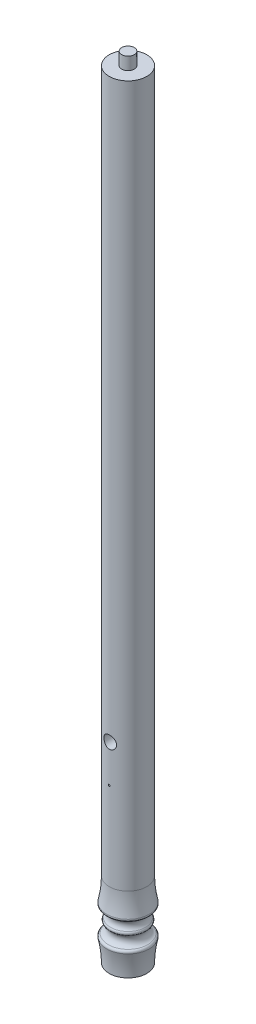
ISO-10303-21;
HEADER;
FILE_DESCRIPTION(('STEP AP214'),'2;1');
FILE_NAME('part.step','',(''),(''),'','','');
FILE_SCHEMA(('AUTOMOTIVE_DESIGN { 1 0 10303 214 1 1 1 1 }'));
ENDSEC;
DATA;
#1=APPLICATION_CONTEXT('core data for automotive mechanical design processes');
#2=APPLICATION_PROTOCOL_DEFINITION('international standard','automotive_design',2000,#1);
#3=PRODUCT_CONTEXT('',#1,'mechanical');
#4=PRODUCT('Part','Part','',(#3));
#5=PRODUCT_RELATED_PRODUCT_CATEGORY('part','',(#4));
#6=PRODUCT_DEFINITION_FORMATION('','',#4);
#7=PRODUCT_DEFINITION_CONTEXT('part definition',#1,'design');
#8=PRODUCT_DEFINITION('design','',#6,#7);
#9=PRODUCT_DEFINITION_SHAPE('','',#8);
#10=(LENGTH_UNIT() NAMED_UNIT(*) SI_UNIT(.MILLI.,.METRE.));
#11=(NAMED_UNIT(*) PLANE_ANGLE_UNIT() SI_UNIT($,.RADIAN.));
#12=(NAMED_UNIT(*) SI_UNIT($,.STERADIAN.) SOLID_ANGLE_UNIT());
#13=UNCERTAINTY_MEASURE_WITH_UNIT(LENGTH_MEASURE(1.E-05),#10,'distance_accuracy_value','');
#14=(GEOMETRIC_REPRESENTATION_CONTEXT(3) GLOBAL_UNCERTAINTY_ASSIGNED_CONTEXT((#13)) GLOBAL_UNIT_ASSIGNED_CONTEXT((#10,
#11,#12)) REPRESENTATION_CONTEXT('',''));
#15=CARTESIAN_POINT('',(0.,0.,0.));
#16=DIRECTION('',(0.,0.,1.));
#17=DIRECTION('',(1.,0.,0.));
#18=AXIS2_PLACEMENT_3D('',#15,#16,#17);
#19=CARTESIAN_POINT('',(6.35,800.1,0.));
#20=DIRECTION('',(0.,1.,0.));
#21=DIRECTION('',(0.,0.,1.));
#22=AXIS2_PLACEMENT_3D('',#19,#20,#21);
#23=PLANE('',#22);
#24=CARTESIAN_POINT('',(0.,800.1,0.));
#25=DIRECTION('',(0.,-1.,0.));
#26=DIRECTION('',(0.,0.,-1.));
#27=AXIS2_PLACEMENT_3D('',#24,#25,#26);
#28=CIRCLE('',#27,6.35);
#29=CARTESIAN_POINT('',(0.,800.1,-6.35));
#30=VERTEX_POINT('',#29);
#31=EDGE_CURVE('E49',#30,#30,#28,.T.);
#32=ORIENTED_EDGE('',*,*,#31,.F.);
#33=EDGE_LOOP('',(#32));
#34=FACE_BOUND('',#33,.T.);
#35=ADVANCED_FACE('F30',(#34),#23,.T.);
#36=CARTESIAN_POINT('',(0.,-55.,0.));
#37=DIRECTION('',(0.,-1.,0.));
#38=DIRECTION('',(0.,0.,-1.));
#39=AXIS2_PLACEMENT_3D('',#36,#37,#38);
#40=CYLINDRICAL_SURFACE('',#39,6.35);
#41=ORIENTED_EDGE('',*,*,#31,.T.);
#42=EDGE_LOOP('',(#41));
#43=FACE_BOUND('',#42,.T.);
#44=CARTESIAN_POINT('',(0.,787.4,0.));
#45=DIRECTION('',(0.,-1.,0.));
#46=DIRECTION('',(0.,0.,-1.));
#47=AXIS2_PLACEMENT_3D('',#44,#45,#46);
#48=CIRCLE('',#47,6.35);
#49=CARTESIAN_POINT('',(0.,787.4,-6.35));
#50=VERTEX_POINT('',#49);
#51=EDGE_CURVE('E124',#50,#50,#48,.T.);
#52=ORIENTED_EDGE('',*,*,#51,.F.);
#53=EDGE_LOOP('',(#52));
#54=FACE_BOUND('',#53,.T.);
#55=ADVANCED_FACE('F116',(#43,#54),#40,.T.);
#56=CARTESIAN_POINT('',(19.05,787.4,0.));
#57=DIRECTION('',(0.,1.,0.));
#58=DIRECTION('',(0.,0.,1.));
#59=AXIS2_PLACEMENT_3D('',#56,#57,#58);
#60=PLANE('',#59);
#61=ORIENTED_EDGE('',*,*,#51,.T.);
#62=EDGE_LOOP('',(#61));
#63=FACE_BOUND('',#62,.T.);
#64=CARTESIAN_POINT('',(0.,787.4,0.));
#65=DIRECTION('',(0.,-1.,0.));
#66=DIRECTION('',(0.,0.,-1.));
#67=AXIS2_PLACEMENT_3D('',#64,#65,#66);
#68=CIRCLE('',#67,19.05);
#69=CARTESIAN_POINT('',(0.,787.4,-19.05));
#70=VERTEX_POINT('',#69);
#71=EDGE_CURVE('E126',#70,#70,#68,.T.);
#72=ORIENTED_EDGE('',*,*,#71,.F.);
#73=EDGE_LOOP('',(#72));
#74=FACE_BOUND('',#73,.T.);
#75=ADVANCED_FACE('F111',(#63,#74),#60,.T.);
#76=CARTESIAN_POINT('',(0.,-55.,0.));
#77=DIRECTION('',(0.,-1.,0.));
#78=DIRECTION('',(0.,0.,-1.));
#79=AXIS2_PLACEMENT_3D('',#76,#77,#78);
#80=CYLINDRICAL_SURFACE('',#79,19.05);
#81=CARTESIAN_POINT('',(-19.0241442373854,317.5,0.992187499999749));
#82=CARTESIAN_POINT('',(-19.0241445844981,317.555691040269,0.992185043218098));
#83=CARTESIAN_POINT('',(-19.0243914099018,317.611421499591,0.98748288059788));
#84=CARTESIAN_POINT('',(-19.0253522064707,317.721344788775,0.968791831717444));
#85=CARTESIAN_POINT('',(-19.0260667270266,317.775535731991,0.95479202344379));
#86=CARTESIAN_POINT('',(-19.0278817588493,317.880771746707,0.917907802003643));
#87=CARTESIAN_POINT('',(-19.0289820722649,317.93181841498,0.895027942267843));
#88=CARTESIAN_POINT('',(-19.0314444572828,318.029332847607,0.841040141353616));
#89=CARTESIAN_POINT('',(-19.0328064673575,318.075801684381,0.809934133584315));
#90=CARTESIAN_POINT('',(-19.035640462504,318.162905625914,0.74033950114157));
#91=CARTESIAN_POINT('',(-19.0371125510756,318.20353513275,0.701843873817135));
#92=CARTESIAN_POINT('',(-19.0399998546066,318.27775933255,0.618576834784949));
#93=CARTESIAN_POINT('',(-19.0414150672349,318.311353737422,0.573805166193396));
#94=CARTESIAN_POINT('',(-19.0440299566155,318.370569807011,0.479227279740224));
#95=CARTESIAN_POINT('',(-19.0452295142131,318.396187069847,0.429418302242876));
#96=CARTESIAN_POINT('',(-19.0472768660109,318.438693435084,0.326199109710505));
#97=CARTESIAN_POINT('',(-19.0481246630397,318.455582607674,0.272788923639271));
#98=CARTESIAN_POINT('',(-19.0493722619553,318.4801384693,0.163935309032712));
#99=CARTESIAN_POINT('',(-19.0497724736062,318.487813594265,0.108493788296012));
#100=CARTESIAN_POINT('',(-19.0500811779553,318.493749528879,-0.00289203821497896));
#101=CARTESIAN_POINT('',(-19.0499896747764,318.492010417462,-0.0588363397697847));
#102=CARTESIAN_POINT('',(-19.0493256053153,318.47917424011,-0.169582550049094));
#103=CARTESIAN_POINT('',(-19.0487535057648,318.468086253306,-0.224385514287298));
#104=CARTESIAN_POINT('',(-19.0471932164615,318.436881148761,-0.331351237860088));
#105=CARTESIAN_POINT('',(-19.0462050248553,318.416763990798,-0.383513985432356));
#106=CARTESIAN_POINT('',(-19.0439230534334,318.368061255084,-0.483747787650107));
#107=CARTESIAN_POINT('',(-19.0426291245274,318.339471544027,-0.531816830427068));
#108=CARTESIAN_POINT('',(-19.0398813805816,318.274638275899,-0.622476732686403));
#109=CARTESIAN_POINT('',(-19.0384275643113,318.238394659922,-0.665067550003683));
#110=CARTESIAN_POINT('',(-19.0355217132746,318.159231086143,-0.743614961730765));
#111=CARTESIAN_POINT('',(-19.0340696826742,318.116303250859,-0.779563617495258));
#112=CARTESIAN_POINT('',(-19.0313328350708,318.025017464577,-0.843745091637092));
#113=CARTESIAN_POINT('',(-19.0300480181152,317.976659512042,-0.871977907830149));
#114=CARTESIAN_POINT('',(-19.027790620048,317.875881366086,-0.919925602895114));
#115=CARTESIAN_POINT('',(-19.0268180500779,317.823461027796,-0.939640177830708));
#116=CARTESIAN_POINT('',(-19.0252952446916,317.716048317855,-0.969986436610965));
#117=CARTESIAN_POINT('',(-19.0247450058288,317.661055967198,-0.980618194580605));
#118=CARTESIAN_POINT('',(-19.0241295521151,317.550129431922,-0.992487193401247));
#119=CARTESIAN_POINT('',(-19.0240637682688,317.494196429555,-0.993735455264031));
#120=CARTESIAN_POINT('',(-19.0244231574489,317.382915523289,-0.986830794194314));
#121=CARTESIAN_POINT('',(-19.0248483287111,317.327567617287,-0.978677905042776));
#122=CARTESIAN_POINT('',(-19.0261411888976,317.219059017006,-0.953211515393148));
#123=CARTESIAN_POINT('',(-19.0270086339029,317.165897134556,-0.935903064093718));
#124=CARTESIAN_POINT('',(-19.0290880675672,317.063233039659,-0.892621984223024));
#125=CARTESIAN_POINT('',(-19.0303000583918,317.013730850218,-0.866649301193601));
#126=CARTESIAN_POINT('',(-19.0329333686741,316.91974063529,-0.806748759970192));
#127=CARTESIAN_POINT('',(-19.0343548823998,316.875257331588,-0.772813501464653));
#128=CARTESIAN_POINT('',(-19.0372463406283,316.792615113154,-0.69796191210156));
#129=CARTESIAN_POINT('',(-19.0387162854655,316.754456242102,-0.6570455330333));
#130=CARTESIAN_POINT('',(-19.0415405971984,316.685509015214,-0.569345817653595));
#131=CARTESIAN_POINT('',(-19.0428948516259,316.654727780214,-0.522556879015999));
#132=CARTESIAN_POINT('',(-19.0453335519248,316.601458278856,-0.424468506096489));
#133=CARTESIAN_POINT('',(-19.046417999045,316.578969974113,-0.373169092693762));
#134=CARTESIAN_POINT('',(-19.0481943335062,316.542937135282,-0.267542414703734));
#135=CARTESIAN_POINT('',(-19.0488864204454,316.529388053132,-0.213216705105179));
#136=CARTESIAN_POINT('',(-19.049800833078,316.511603375609,-0.103057793332272));
#137=CARTESIAN_POINT('',(-19.0500231617197,316.507367721783,-0.0472246006216997));
#138=CARTESIAN_POINT('',(-19.0499730147725,316.508330690854,0.064293733449856));
#139=CARTESIAN_POINT('',(-19.0497011247923,316.51351814813,0.119978971835852));
#140=CARTESIAN_POINT('',(-19.0486942988733,316.533156994488,0.229686785936752));
#141=CARTESIAN_POINT('',(-19.0479593620701,316.547608400865,0.283709358547096));
#142=CARTESIAN_POINT('',(-19.0461091152987,316.585362595864,0.388560558652169));
#143=CARTESIAN_POINT('',(-19.0449938032257,316.608665433465,0.439389168471402));
#144=CARTESIAN_POINT('',(-19.0425082060983,316.663459151627,0.536413419752056));
#145=CARTESIAN_POINT('',(-19.0411379286869,316.694949786752,0.582609200027761));
#146=CARTESIAN_POINT('',(-19.0382947482457,316.765265445288,0.66911241953694));
#147=CARTESIAN_POINT('',(-19.036821736537,316.80409831238,0.709413479038762));
#148=CARTESIAN_POINT('',(-19.0339398703215,316.887989815767,0.782937242487005));
#149=CARTESIAN_POINT('',(-19.0325310316757,316.933049980237,0.816158203878246));
#150=CARTESIAN_POINT('',(-19.0299354053937,317.028154846084,0.874595691160021));
#151=CARTESIAN_POINT('',(-19.0287488416472,317.078204496294,0.89980416396434));
#152=CARTESIAN_POINT('',(-19.0267350873092,317.181794690062,0.941429919122583));
#153=CARTESIAN_POINT('',(-19.0259074729913,317.235331031335,0.957857572259918));
#154=CARTESIAN_POINT('',(-19.0249237977219,317.324332699273,0.977152274060645));
#155=CARTESIAN_POINT('',(-19.0246327544357,317.359221714481,0.982783271459935));
#156=CARTESIAN_POINT('',(-19.0242428643261,317.429401872141,0.990301661453642));
#157=CARTESIAN_POINT('',(-19.024144017323,317.464693014217,0.992189057549301));
#158=CARTESIAN_POINT('',(-19.0241442373854,317.5,0.992187499999749));
#159=B_SPLINE_CURVE_WITH_KNOTS('',3,(#81,#82,#83,#84,#85,#86,#87,#88,#89,#90,#91,#92,#93,#94,
#95,#96,#97,#98,#99,#100,#101,#102,#103,#104,#105,#106,#107,#108,#109,#110,#111,#112,#113,#114,
#115,#116,#117,#118,#119,#120,#121,#122,#123,#124,#125,#126,#127,#128,#129,#130,#131,#132,#133,
#134,#135,#136,#137,#138,#139,#140,#141,#142,#143,#144,#145,#146,#147,#148,#149,#150,#151,#152,
#153,#154,#155,#156,#157,#158),.UNSPECIFIED.,.T.,.F.,(4,2,2,2,2,2,2,2,2,2,2,2,2,2,2,2,2,2,2,2,2,
2,2,2,2,2,2,2,2,2,2,2,2,2,2,2,2,2,4),(0.,0.16694423544984,0.334084929236096,0.501140031153446,
0.668155904594909,0.835330836242322,1.00251261250349,1.16978647882014,1.33705899994751,
1.50417825750052,1.67129611384653,1.83825186091784,2.00520835172121,2.17224642611254,
2.33928578609435,2.50652351637456,2.67376129399819,2.84100503828039,3.00824741767137,
3.17529333844781,3.34233865898343,3.50929195163703,3.67624629367856,3.84335641979023,
4.01046769998933,4.17773963092786,4.34501078759805,4.51219677491257,4.67938171289964,
4.8463686795152,5.01335595791313,5.18034416034288,5.34732735777994,5.51448996120059,
5.68169365932372,5.8490648807994,6.01623798549661,6.12207733114092,6.22791657779787),.UNSPECIFIED.);
#160=CARTESIAN_POINT('',(-19.0241442373854,317.5,0.992187499999749));
#161=VERTEX_POINT('',#160);
#162=EDGE_CURVE('E10',#161,#161,#159,.T.);
#163=ORIENTED_EDGE('',*,*,#162,.F.);
#164=EDGE_LOOP('',(#163));
#165=FACE_BOUND('',#164,.T.);
#166=CARTESIAN_POINT('',(0.992187499999998,165.1,19.0241442373854));
#167=CARTESIAN_POINT('',(0.992185043218346,165.155691040269,19.0241445844981));
#168=CARTESIAN_POINT('',(0.98748288059813,165.211421499591,19.0243914099017));
#169=CARTESIAN_POINT('',(0.968791831717696,165.321344788775,19.0253522064706));
#170=CARTESIAN_POINT('',(0.954792023444044,165.375535731991,19.0260667270266));
#171=CARTESIAN_POINT('',(0.917907802003896,165.480771746707,19.0278817588493));
#172=CARTESIAN_POINT('',(0.895027942268089,165.53181841498,19.0289820722649));
#173=CARTESIAN_POINT('',(0.841040141353868,165.629332847607,19.0314444572828));
#174=CARTESIAN_POINT('',(0.809934133584581,165.675801684381,19.0328064673575));
#175=CARTESIAN_POINT('',(0.740339501141854,165.762905625914,19.035640462504));
#176=CARTESIAN_POINT('',(0.701843873817429,165.80353513275,19.0371125510756));
#177=CARTESIAN_POINT('',(0.618576834785258,165.87775933255,19.0399998546066));
#178=CARTESIAN_POINT('',(0.573805166193708,165.911353737422,19.0414150672349));
#179=CARTESIAN_POINT('',(0.479227279740542,165.970569807011,19.0440299566155));
#180=CARTESIAN_POINT('',(0.429418302243197,165.996187069847,19.0452295142131));
#181=CARTESIAN_POINT('',(0.326199109710824,166.038693435084,19.0472768660109));
#182=CARTESIAN_POINT('',(0.272788923639586,166.055582607674,19.0481246630397));
#183=CARTESIAN_POINT('',(0.163935309033025,166.0801384693,19.0493722619553));
#184=CARTESIAN_POINT('',(0.108493788296328,166.087813594265,19.0497724736062));
#185=CARTESIAN_POINT('',(-0.00289203821465988,166.093749528879,19.0500811779553));
#186=CARTESIAN_POINT('',(-0.0588363397694651,166.092010417462,19.0499896747764));
#187=CARTESIAN_POINT('',(-0.169582550048771,166.07917424011,19.0493256053153));
#188=CARTESIAN_POINT('',(-0.224385514286971,166.068086253306,19.0487535057648));
#189=CARTESIAN_POINT('',(-0.331351237859761,166.036881148761,19.0471932164615));
#190=CARTESIAN_POINT('',(-0.383513985432034,166.016763990798,19.0462050248553));
#191=CARTESIAN_POINT('',(-0.483747787649793,165.968061255084,19.0439230534334));
#192=CARTESIAN_POINT('',(-0.53181683042676,165.939471544027,19.0426291245274));
#193=CARTESIAN_POINT('',(-0.622476732686098,165.874638275899,19.0398813805816));
#194=CARTESIAN_POINT('',(-0.665067550003376,165.838394659922,19.0384275643113));
#195=CARTESIAN_POINT('',(-0.74361496173046,165.759231086143,19.0355217132746));
#196=CARTESIAN_POINT('',(-0.779563617494958,165.716303250859,19.0340696826742));
#197=CARTESIAN_POINT('',(-0.843745091636795,165.625017464577,19.0313328350708));
#198=CARTESIAN_POINT('',(-0.871977907829854,165.576659512042,19.0300480181152));
#199=CARTESIAN_POINT('',(-0.919925602894831,165.475881366086,19.027790620048));
#200=CARTESIAN_POINT('',(-0.939640177830428,165.423461027796,19.0268180500779));
#201=CARTESIAN_POINT('',(-0.96998643661068,165.316048317854,19.0252952446916));
#202=CARTESIAN_POINT('',(-0.980618194580318,165.261055967198,19.0247450058288));
#203=CARTESIAN_POINT('',(-0.992487193400962,165.150129431922,19.0241295521151));
#204=CARTESIAN_POINT('',(-0.993735455263746,165.094196429555,19.0240637682688));
#205=CARTESIAN_POINT('',(-0.98683079419403,164.982915523289,19.0244231574489));
#206=CARTESIAN_POINT('',(-0.978677905042498,164.927567617287,19.0248483287111));
#207=CARTESIAN_POINT('',(-0.953211515392871,164.819059017006,19.0261411888976));
#208=CARTESIAN_POINT('',(-0.935903064093436,164.765897134556,19.0270086339029));
#209=CARTESIAN_POINT('',(-0.892621984222755,164.663233039659,19.0290880675672));
#210=CARTESIAN_POINT('',(-0.866649301193354,164.613730850218,19.0303000583919));
#211=CARTESIAN_POINT('',(-0.806748759969968,164.51974063529,19.0329333686741));
#212=CARTESIAN_POINT('',(-0.77281350146442,164.475257331588,19.0343548823998));
#213=CARTESIAN_POINT('',(-0.697961912101311,164.392615113154,19.0372463406283));
#214=CARTESIAN_POINT('',(-0.657045533033046,164.354456242102,19.0387162854655));
#215=CARTESIAN_POINT('',(-0.569345817653353,164.285509015214,19.0415405971984));
#216=CARTESIAN_POINT('',(-0.522556879015775,164.254727780214,19.0428948516259));
#217=CARTESIAN_POINT('',(-0.424468506096285,164.201458278856,19.0453335519248));
#218=CARTESIAN_POINT('',(-0.373169092693557,164.178969974113,19.046417999045));
#219=CARTESIAN_POINT('',(-0.267542414703524,164.142937135282,19.0481943335062));
#220=CARTESIAN_POINT('',(-0.213216705104964,164.129388053132,19.0488864204454));
#221=CARTESIAN_POINT('',(-0.103057793332053,164.111603375609,19.049800833078));
#222=CARTESIAN_POINT('',(-0.0472246006214822,164.107367721783,19.0500231617197));
#223=CARTESIAN_POINT('',(0.0642937334500748,164.108330690854,19.0499730147725));
#224=CARTESIAN_POINT('',(0.119978971836073,164.11351814813,19.0497011247923));
#225=CARTESIAN_POINT('',(0.229686785936969,164.133156994488,19.0486942988733));
#226=CARTESIAN_POINT('',(0.283709358547306,164.147608400865,19.04795936207));
#227=CARTESIAN_POINT('',(0.388560558652384,164.185362595864,19.0461091152987));
#228=CARTESIAN_POINT('',(0.43938916847163,164.208665433465,19.0449938032257));
#229=CARTESIAN_POINT('',(0.536413419752289,164.263459151626,19.0425082060983));
#230=CARTESIAN_POINT('',(0.582609200027987,164.294949786752,19.0411379286869));
#231=CARTESIAN_POINT('',(0.669112419537181,164.365265445288,19.0382947482456));
#232=CARTESIAN_POINT('',(0.709413479039021,164.404098312381,19.036821736537));
#233=CARTESIAN_POINT('',(0.782937242487253,164.487989815767,19.0339398703215));
#234=CARTESIAN_POINT('',(0.816158203878474,164.533049980237,19.0325310316757));
#235=CARTESIAN_POINT('',(0.874595691160242,164.628154846084,19.0299354053937));
#236=CARTESIAN_POINT('',(0.899804163964569,164.678204496294,19.0287488416472));
#237=CARTESIAN_POINT('',(0.941429919122817,164.781794690062,19.0267350873092));
#238=CARTESIAN_POINT('',(0.957857572260151,164.835331031335,19.0259074729913));
#239=CARTESIAN_POINT('',(0.977152274060882,164.924332699273,19.0249237977219));
#240=CARTESIAN_POINT('',(0.982783271460175,164.959221714481,19.0246327544357));
#241=CARTESIAN_POINT('',(0.990301661453891,165.029401872141,19.0242428643261));
#242=CARTESIAN_POINT('',(0.99218905754955,165.064693014217,19.024144017323));
#243=CARTESIAN_POINT('',(0.992187499999998,165.1,19.0241442373854));
#244=B_SPLINE_CURVE_WITH_KNOTS('',3,(#166,#167,#168,#169,#170,#171,#172,#173,#174,#175,#176,
#177,#178,#179,#180,#181,#182,#183,#184,#185,#186,#187,#188,#189,#190,#191,#192,#193,#194,#195,
#196,#197,#198,#199,#200,#201,#202,#203,#204,#205,#206,#207,#208,#209,#210,#211,#212,#213,#214,
#215,#216,#217,#218,#219,#220,#221,#222,#223,#224,#225,#226,#227,#228,#229,#230,#231,#232,#233,
#234,#235,#236,#237,#238,#239,#240,#241,#242,#243),.UNSPECIFIED.,.T.,.F.,(4,2,2,2,2,2,2,2,2,2,2,
2,2,2,2,2,2,2,2,2,2,2,2,2,2,2,2,2,2,2,2,2,2,2,2,2,2,2,4),(0.,0.166944235449867,
0.334084929236068,0.50114003115342,0.668155904594897,0.835330836242241,1.0025126125034,
1.16978647882007,1.33705899994744,1.50417825750044,1.67129611384644,1.83825186091775,
2.00520835172111,2.17224642611245,2.33928578609428,2.50652351637451,2.67376129399809,
2.84100503828037,3.00824741767132,3.17529333844778,3.34233865898338,3.50929195163695,
3.67624629367838,3.84335641979014,4.01046769998924,4.17773963092771,4.34501078759792,
4.51219677491244,4.67938171289952,4.84636867951507,5.01335595791301,5.18034416034276,
5.34732735777981,5.51448996120054,5.68169365932357,5.84906488079926,6.01623798549644,
6.12207733114073,6.22791657779776),.UNSPECIFIED.);
#245=CARTESIAN_POINT('',(0.992187499999998,165.1,19.0241442373854));
#246=VERTEX_POINT('',#245);
#247=EDGE_CURVE('E41',#246,#246,#244,.T.);
#248=ORIENTED_EDGE('',*,*,#247,.F.);
#249=EDGE_LOOP('',(#248));
#250=FACE_BOUND('',#249,.T.);
#251=CARTESIAN_POINT('',(6.35,203.2,17.9605122421383));
#252=CARTESIAN_POINT('',(6.35000007467186,203.372904889361,17.9605121841743));
#253=CARTESIAN_POINT('',(6.3429320744315,203.54580869932,17.9630158170993));
#254=CARTESIAN_POINT('',(6.31472584323583,203.890384353829,17.9729507908354));
#255=CARTESIAN_POINT('',(6.29358247647192,204.062055725569,17.9803839303173));
#256=CARTESIAN_POINT('',(6.23743424237859,204.402797778446,17.9999387474086));
#257=CARTESIAN_POINT('',(6.20243278653587,204.571869089014,18.0120592710938));
#258=CARTESIAN_POINT('',(6.1188793825932,204.906322983684,18.0406142280405));
#259=CARTESIAN_POINT('',(6.07032213901403,205.071704098914,18.0570503470113));
#260=CARTESIAN_POINT('',(5.96022151507749,205.39720479015,18.0936898864177));
#261=CARTESIAN_POINT('',(5.89870940004715,205.557335980017,18.1138842233465));
#262=CARTESIAN_POINT('',(5.76310329571688,205.871791643544,18.1574836120493));
#263=CARTESIAN_POINT('',(5.68900463798159,206.026113936605,18.1808898545199));
#264=CARTESIAN_POINT('',(5.52880871589195,206.327932045638,18.2302439315275));
#265=CARTESIAN_POINT('',(5.44271370019568,206.475429134074,18.2561912894747));
#266=CARTESIAN_POINT('',(5.25907267568228,206.762828565815,18.3099374140938));
#267=CARTESIAN_POINT('',(5.16152255221945,206.902728153566,18.3377368444647));
#268=CARTESIAN_POINT('',(4.9519704663745,207.178892454386,18.3954535011269));
#269=CARTESIAN_POINT('',(4.83957945535955,207.314853715155,18.4254108542597));
#270=CARTESIAN_POINT('',(4.60392786160509,207.576916980907,18.4857008813243));
#271=CARTESIAN_POINT('',(4.48066706722363,207.70301879383,18.5160335625541));
#272=CARTESIAN_POINT('',(4.22398755491756,207.944628902319,18.5762700584007));
#273=CARTESIAN_POINT('',(4.09056546226526,208.060133650106,18.6061737265825));
#274=CARTESIAN_POINT('',(3.81445197871255,208.279720436423,18.6647358311806));
#275=CARTESIAN_POINT('',(3.67176383491662,208.383806442406,18.6933946980002));
#276=CARTESIAN_POINT('',(3.37403362595511,208.582496600939,18.7494517961145));
#277=CARTESIAN_POINT('',(3.21876410858282,208.676775524071,18.776796334375));
#278=CARTESIAN_POINT('',(2.90040622051583,208.851825218583,18.828598949967));
#279=CARTESIAN_POINT('',(2.73732096720632,208.932601318944,18.853058164884));
#280=CARTESIAN_POINT('',(2.40436062510117,209.08002587764,18.8984068456182));
#281=CARTESIAN_POINT('',(2.23448415681591,209.146671448152,18.9192955815763));
#282=CARTESIAN_POINT('',(1.88927888325926,209.265180132633,18.9568787025541));
#283=CARTESIAN_POINT('',(1.71395256686033,209.317049887631,18.9735749714878));
#284=CARTESIAN_POINT('',(1.36522428846162,209.404017816687,19.0017947733667));
#285=CARTESIAN_POINT('',(1.19196364650287,209.439631609418,19.01347650807));
#286=CARTESIAN_POINT('',(0.842895111101337,209.496290767647,19.0321454456513));
#287=CARTESIAN_POINT('',(0.667088294148725,209.517342116387,19.0391345765353));
#288=CARTESIAN_POINT('',(0.314209218879324,209.544689916081,19.0482262560928));
#289=CARTESIAN_POINT('',(0.137136994473655,209.550986760958,19.0503289352273));
#290=CARTESIAN_POINT('',(-0.216901921002752,209.548762746674,19.049587568049));
#291=CARTESIAN_POINT('',(-0.393868614421923,209.540242230575,19.0467436362635));
#292=CARTESIAN_POINT('',(-0.739365284519371,209.509098834915,19.036399993617));
#293=CARTESIAN_POINT('',(-0.907952629393979,209.487045678578,19.0290884203769));
#294=CARTESIAN_POINT('',(-1.24263965626491,209.429541429088,19.0101669985195));
#295=CARTESIAN_POINT('',(-1.40873847746822,209.394085806336,18.9985556967605));
#296=CARTESIAN_POINT('',(-1.73720119624073,209.310103056509,18.9713411108767));
#297=CARTESIAN_POINT('',(-1.89956629068115,209.261580183459,18.9557391259958));
#298=CARTESIAN_POINT('',(-2.21961616319674,209.151842972193,18.9209335884611));
#299=CARTESIAN_POINT('',(-2.37729914957653,209.090623845284,18.9017286771399));
#300=CARTESIAN_POINT('',(-2.68891421853452,208.95512588426,18.8599382105028));
#301=CARTESIAN_POINT('',(-2.84277277712819,208.880690392267,18.8373126491989));
#302=CARTESIAN_POINT('',(-3.14372828729916,208.719836604718,18.7894305663877));
#303=CARTESIAN_POINT('',(-3.29082290202757,208.633414208657,18.7641731453072));
#304=CARTESIAN_POINT('',(-3.57734506918722,208.449201047919,18.7116626522826));
#305=CARTESIAN_POINT('',(-3.71677219114134,208.351409645908,18.6844094684901));
#306=CARTESIAN_POINT('',(-3.98716495399287,208.145092345574,18.6285822698494));
#307=CARTESIAN_POINT('',(-4.11813028669789,208.036566056633,18.6000082069575));
#308=CARTESIAN_POINT('',(-4.37684545048267,207.804061657267,18.5408779551479));
#309=CARTESIAN_POINT('',(-4.50415027127114,207.6795955105,18.5102919359601));
#310=CARTESIAN_POINT('',(-4.7478433962042,207.420439729617,18.4492888676298));
#311=CARTESIAN_POINT('',(-4.86423510815806,207.28575331089,18.4188717685491));
#312=CARTESIAN_POINT('',(-5.08546063018025,207.006873293863,18.3590231511138));
#313=CARTESIAN_POINT('',(-5.19028832447544,206.862674728752,18.3295921599489));
#314=CARTESIAN_POINT('',(-5.38756027003842,206.56577596231,18.2725815338622));
#315=CARTESIAN_POINT('',(-5.48000935232799,206.41307911075,18.2450011787983));
#316=CARTESIAN_POINT('',(-5.65315834756607,206.097778751356,18.1921032459389));
#317=CARTESIAN_POINT('',(-5.73366516353338,205.935062459729,18.1668249772564));
#318=CARTESIAN_POINT('',(-5.88057969904577,205.602964036741,18.1198022602485));
#319=CARTESIAN_POINT('',(-5.94699291679966,205.43358453552,18.0980564346222));
#320=CARTESIAN_POINT('',(-6.06515064268836,205.089327918963,18.0588019342271));
#321=CARTESIAN_POINT('',(-6.11689722174378,204.914451583655,18.0412926613107));
#322=CARTESIAN_POINT('',(-6.20522346520948,204.560502363422,18.0111045097315));
#323=CARTESIAN_POINT('',(-6.24180391182511,204.381429695431,17.9984253819528));
#324=CARTESIAN_POINT('',(-6.298116997968,204.02865770232,17.9787949890032));
#325=CARTESIAN_POINT('',(-6.31853543370885,203.855080565666,17.971611063163));
#326=CARTESIAN_POINT('',(-6.34499394377563,203.506700961397,17.962286912437));
#327=CARTESIAN_POINT('',(-6.35103452507011,203.331898537203,17.9601465097146));
#328=CARTESIAN_POINT('',(-6.34867652793738,202.982432503792,17.9609801314463));
#329=CARTESIAN_POINT('',(-6.34028025622768,202.807768876858,17.9639533388488));
#330=CARTESIAN_POINT('',(-6.309138563187,202.459886859651,17.9749142495206));
#331=CARTESIAN_POINT('',(-6.28639331827605,202.286668451635,17.9829018911375));
#332=CARTESIAN_POINT('',(-6.22781361622577,201.948923786007,18.0032708197849));
#333=CARTESIAN_POINT('',(-6.19245924965254,201.784304144327,18.0154905329272));
#334=CARTESIAN_POINT('',(-6.1088890589727,201.458667222114,18.0439996158971));
#335=CARTESIAN_POINT('',(-6.06066897527755,201.297651153825,18.0602903334414));
#336=CARTESIAN_POINT('',(-5.95178614996645,200.980344253033,18.0964645265794));
#337=CARTESIAN_POINT('',(-5.89112619656182,200.824052370664,18.1163471969716));
#338=CARTESIAN_POINT('',(-5.75780047904466,200.517043863517,18.1591611703442));
#339=CARTESIAN_POINT('',(-5.68513015384567,200.366329383541,18.1820936308712));
#340=CARTESIAN_POINT('',(-5.52585539435068,200.066776077376,18.2311431035954));
#341=CARTESIAN_POINT('',(-5.43888551843611,199.918144213939,18.257337418412));
#342=CARTESIAN_POINT('',(-5.25331510969612,199.628619635699,18.3115953760894));
#343=CARTESIAN_POINT('',(-5.15471056388416,199.487729615888,18.3396596624723));
#344=CARTESIAN_POINT('',(-4.94651983263571,199.214534062527,18.3969044730028));
#345=CARTESIAN_POINT('',(-4.83693265707057,199.082229304748,18.4260850976459));
#346=CARTESIAN_POINT('',(-4.60744722274103,198.826970457001,18.4848033864811));
#347=CARTESIAN_POINT('',(-4.48754872480688,198.70401658405,18.5143410589412));
#348=CARTESIAN_POINT('',(-4.23209963560971,198.462468313809,18.5744412121884));
#349=CARTESIAN_POINT('',(-4.09607248840989,198.344372396216,18.6049841614765));
#350=CARTESIAN_POINT('',(-3.81435164909173,198.120075783773,18.664778246815));
#351=CARTESIAN_POINT('',(-3.66866120488883,198.01387112411,18.6940298114599));
#352=CARTESIAN_POINT('',(-3.36843369307492,197.814029018183,18.7504530318865));
#353=CARTESIAN_POINT('',(-3.21389329221659,197.720396352035,18.7776238948672));
#354=CARTESIAN_POINT('',(-2.89708847566715,197.546504266404,18.8291029215125));
#355=CARTESIAN_POINT('',(-2.73482733528807,197.466239239962,18.8534122841516));
#356=CARTESIAN_POINT('',(-2.40465168177923,197.320158532148,18.8983526620097));
#357=CARTESIAN_POINT('',(-2.23677842238125,197.25425641078,18.9190055333313));
#358=CARTESIAN_POINT('',(-1.89569072154765,197.136884410199,18.9562198624823));
#359=CARTESIAN_POINT('',(-1.72247847967075,197.085408673518,18.9727829805259));
#360=CARTESIAN_POINT('',(-1.37195443604881,196.997347928175,19.0013461729396));
#361=CARTESIAN_POINT('',(-1.19464302596228,196.960761503064,19.0133466813523));
#362=CARTESIAN_POINT('',(-0.837286870863805,196.902841052107,19.0324318084485));
#363=CARTESIAN_POINT('',(-0.657242243866576,196.881506369625,19.0395166387673));
#364=CARTESIAN_POINT('',(-0.304399939069074,196.854950793771,19.0483464738216));
#365=CARTESIAN_POINT('',(-0.131661476409825,196.849016627736,19.050327811339));
#366=CARTESIAN_POINT('',(0.213775392275974,196.85124883539,19.049583701765));
#367=CARTESIAN_POINT('',(0.386473764626108,196.859420011876,19.0468566514914));
#368=CARTESIAN_POINT('',(0.730414910159569,196.889787139717,19.036769222305));
#369=CARTESIAN_POINT('',(0.901658307858205,196.911976730034,19.0294109448771));
#370=CARTESIAN_POINT('',(1.24159215291772,196.970176911002,19.010258841641));
#371=CARTESIAN_POINT('',(1.41028162241908,197.006192662985,18.9984633594488));
#372=CARTESIAN_POINT('',(1.74113205541995,197.091019049772,18.9709796061496));
#373=CARTESIAN_POINT('',(1.90335462060483,197.139611475508,18.9553579469971));
#374=CARTESIAN_POINT('',(2.22311558916084,197.249466677602,18.920521496432));
#375=CARTESIAN_POINT('',(2.38065230104731,197.3107339673,18.9013054253338));
#376=CARTESIAN_POINT('',(2.68996559538902,197.445433581555,18.8597702235758));
#377=CARTESIAN_POINT('',(2.84174342474923,197.518863254042,18.8374517695764));
#378=CARTESIAN_POINT('',(3.13872746855849,197.677388806124,18.7902503646299));
#379=CARTESIAN_POINT('',(3.28393130265415,197.762488867175,18.7653664953012));
#380=CARTESIAN_POINT('',(3.57209205622814,197.947095714141,18.7126933760356));
#381=CARTESIAN_POINT('',(3.71477001212557,198.047017192484,18.6848309370529));
#382=CARTESIAN_POINT('',(3.99127224330517,198.2580874263,18.6277261015556));
#383=CARTESIAN_POINT('',(4.125096208222,198.369236574998,18.5984836567283));
#384=CARTESIAN_POINT('',(4.38316388676335,198.602109747918,18.5393610594388));
#385=CARTESIAN_POINT('',(4.50740324126622,198.723838530901,18.5094806246122));
#386=CARTESIAN_POINT('',(4.74546004441079,198.977051111197,18.4498824788936));
#387=CARTESIAN_POINT('',(4.85928083833073,199.108531752582,18.4201647186707));
#388=CARTESIAN_POINT('',(5.08014127120139,199.385904679787,18.3605083051536));
#389=CARTESIAN_POINT('',(5.18673395080547,199.53216146794,18.3306074981088));
#390=CARTESIAN_POINT('',(5.38716410257996,199.833445881564,18.2727076517125));
#391=CARTESIAN_POINT('',(5.48100632994388,199.988470206525,18.2447079053334));
#392=CARTESIAN_POINT('',(5.65528861435426,200.306373373264,18.191440834821));
#393=CARTESIAN_POINT('',(5.73572598484047,200.46925378112,18.1661740587765));
#394=CARTESIAN_POINT('',(5.88247472021432,200.801671020857,18.1191867962331));
#395=CARTESIAN_POINT('',(5.9487924600178,200.971204807661,18.09746471037));
#396=CARTESIAN_POINT('',(6.06410020462713,201.308057840573,18.0591448851981));
#397=CARTESIAN_POINT('',(6.11373361228482,201.475135783141,18.042361110104));
#398=CARTESIAN_POINT('',(6.19914429051322,201.813106231664,18.0131937705727));
#399=CARTESIAN_POINT('',(6.2349272745633,201.983997133889,18.0008083919142));
#400=CARTESIAN_POINT('',(6.29232024349929,202.328403857294,17.9808267796658));
#401=CARTESIAN_POINT('',(6.31393168801609,202.501919406258,17.9732300528606));
#402=CARTESIAN_POINT('',(6.34277149992563,202.85029034166,17.9630728234143));
#403=CARTESIAN_POINT('',(6.34999992448626,203.02514572277,17.9605123007558));
#404=CARTESIAN_POINT('',(6.35,203.2,17.9605122421383));
#405=B_SPLINE_CURVE_WITH_KNOTS('',3,(#251,#252,#253,#254,#255,#256,#257,#258,#259,#260,#261,
#262,#263,#264,#265,#266,#267,#268,#269,#270,#271,#272,#273,#274,#275,#276,#277,#278,#279,#280,
#281,#282,#283,#284,#285,#286,#287,#288,#289,#290,#291,#292,#293,#294,#295,#296,#297,#298,#299,
#300,#301,#302,#303,#304,#305,#306,#307,#308,#309,#310,#311,#312,#313,#314,#315,#316,#317,#318,
#319,#320,#321,#322,#323,#324,#325,#326,#327,#328,#329,#330,#331,#332,#333,#334,#335,#336,#337,
#338,#339,#340,#341,#342,#343,#344,#345,#346,#347,#348,#349,#350,#351,#352,#353,#354,#355,#356,
#357,#358,#359,#360,#361,#362,#363,#364,#365,#366,#367,#368,#369,#370,#371,#372,#373,#374,#375,
#376,#377,#378,#379,#380,#381,#382,#383,#384,#385,#386,#387,#388,#389,#390,#391,#392,#393,#394,
#395,#396,#397,#398,#399,#400,#401,#402,#403,#404),.UNSPECIFIED.,.T.,.F.,(4,2,2,2,2,2,2,2,2,2,2,
2,2,2,2,2,2,2,2,2,2,2,2,2,2,2,2,2,2,2,2,2,2,2,2,2,2,2,2,2,2,2,2,2,2,2,2,2,2,2,2,2,2,2,2,2,2,2,2,
2,2,2,2,2,2,2,2,2,2,2,2,2,2,2,2,2,4),(0.,0.518551190720193,1.03729169377051,1.55590457625912,
2.07472033562746,2.59229804482699,3.11006814803521,3.62774132802883,4.14560102700589,
4.68177234198808,5.21795409888998,5.75431471335885,6.29048837466618,6.84090158058546,
7.39109704669765,7.94140484680645,8.49146491800032,9.02260055284765,9.55351783122658,
10.084420934737,10.6153117465768,11.1252544428486,11.6353696375179,12.145318965252,
12.6554609833795,13.1721116844525,13.6889395603306,14.2057964229859,14.7226720998248,
15.2639930028963,15.8051443021139,16.3465804375137,16.8878046459562,17.4370000687287,
17.9859808433418,18.5348840635371,19.0837589700888,19.6078648257983,20.1319522010648,
20.6559558455358,21.179953047529,21.6858208709719,22.1918563856785,22.697778603788,
23.2038933954328,23.7258764687288,24.2480401116692,24.7702508722021,25.2924737486133,
25.8399546814312,26.3872525247409,26.934757875636,27.482032997888,28.0259174775812,
28.5695808058328,29.113192402254,29.656780593024,30.1747024737474,30.6928007390253,
31.2106640791972,31.728720927042,32.2383303533507,32.7481215577425,33.2578017455691,
33.7676650293052,34.2962769393839,34.8249073694707,35.3537768226458,35.8824758619216,
36.4321092541269,36.9815370983736,37.5310749251787,38.0803641108161,38.605034396734,
39.1294880181041,39.6538876136575,40.1782851248866),.UNSPECIFIED.);
#406=CARTESIAN_POINT('',(6.35,203.2,17.9605122421383));
#407=VERTEX_POINT('',#406);
#408=EDGE_CURVE('E45',#407,#407,#405,.T.);
#409=ORIENTED_EDGE('',*,*,#408,.F.);
#410=EDGE_LOOP('',(#409));
#411=FACE_BOUND('',#410,.T.);
#412=ORIENTED_EDGE('',*,*,#71,.T.);
#413=EDGE_LOOP('',(#412));
#414=FACE_BOUND('',#413,.T.);
#415=CARTESIAN_POINT('',(0.,76.2,0.));
#416=DIRECTION('',(0.,-1.,0.));
#417=DIRECTION('',(0.,0.,-1.));
#418=AXIS2_PLACEMENT_3D('',#415,#416,#417);
#419=CIRCLE('',#418,19.05);
#420=CARTESIAN_POINT('',(0.,76.2,-19.05));
#421=VERTEX_POINT('',#420);
#422=EDGE_CURVE('E131',#421,#421,#419,.T.);
#423=ORIENTED_EDGE('',*,*,#422,.F.);
#424=EDGE_LOOP('',(#423));
#425=FACE_BOUND('',#424,.T.);
#426=ADVANCED_FACE('F60',(#165,#250,#411,#414,#425),#80,.T.);
#427=CARTESIAN_POINT('',(0.,76.2,0.));
#428=DIRECTION('',(0.,-1.,0.));
#429=DIRECTION('',(0.,0.,-1.));
#430=AXIS2_PLACEMENT_3D('',#427,#428,#429);
#431=TOROIDAL_SURFACE('',#430,122.2375,103.1875);
#432=ORIENTED_EDGE('',*,*,#422,.T.);
#433=EDGE_LOOP('',(#432));
#434=FACE_BOUND('',#433,.T.);
#435=CARTESIAN_POINT('',(0.,53.348293437608,0.));
#436=DIRECTION('',(0.,-1.,0.));
#437=DIRECTION('',(0.,0.,-1.));
#438=AXIS2_PLACEMENT_3D('',#435,#436,#437);
#439=CIRCLE('',#438,21.6121569524539);
#440=CARTESIAN_POINT('',(0.,53.348293437608,-21.6121569524539));
#441=VERTEX_POINT('',#440);
#442=EDGE_CURVE('E133',#441,#441,#439,.T.);
#443=ORIENTED_EDGE('',*,*,#442,.F.);
#444=EDGE_LOOP('',(#443));
#445=FACE_BOUND('',#444,.T.);
#446=ADVANCED_FACE('F104',(#434,#445),#431,.F.);
#447=CARTESIAN_POINT('',(0.,52.7857898914568,0.));
#448=DIRECTION('',(0.,-1.,0.));
#449=DIRECTION('',(0.,0.,-1.));
#450=AXIS2_PLACEMENT_3D('',#447,#448,#449);
#451=TOROIDAL_SURFACE('',#450,19.1352254312836,2.54);
#452=ORIENTED_EDGE('',*,*,#442,.T.);
#453=EDGE_LOOP('',(#452));
#454=FACE_BOUND('',#453,.T.);
#455=CARTESIAN_POINT('',(0.,50.4041356367548,0.));
#456=DIRECTION('',(0.,-1.,0.));
#457=DIRECTION('',(0.,0.,-1.));
#458=AXIS2_PLACEMENT_3D('',#455,#456,#457);
#459=CIRCLE('',#458,20.0180181652025);
#460=CARTESIAN_POINT('',(0.,50.4041356367548,-20.0180181652025));
#461=VERTEX_POINT('',#460);
#462=EDGE_CURVE('E136',#461,#461,#459,.T.);
#463=ORIENTED_EDGE('',*,*,#462,.F.);
#464=EDGE_LOOP('',(#463));
#465=FACE_BOUND('',#464,.T.);
#466=ADVANCED_FACE('F101',(#454,#465),#451,.T.);
#467=CARTESIAN_POINT('',(0.,44.45,0.));
#468=DIRECTION('',(0.,-1.,0.));
#469=DIRECTION('',(0.,0.,-1.));
#470=AXIS2_PLACEMENT_3D('',#467,#468,#469);
#471=TOROIDAL_SURFACE('',#470,22.225,6.35);
#472=ORIENTED_EDGE('',*,*,#462,.T.);
#473=EDGE_LOOP('',(#472));
#474=FACE_BOUND('',#473,.T.);
#475=CARTESIAN_POINT('',(0.,39.9142857142857,0.));
#476=DIRECTION('',(0.,-1.,0.));
#477=DIRECTION('',(0.,0.,-1.));
#478=AXIS2_PLACEMENT_3D('',#475,#476,#477);
#479=CIRCLE('',#478,17.7809257523791);
#480=CARTESIAN_POINT('',(0.,39.9142857142857,-17.7809257523791));
#481=VERTEX_POINT('',#480);
#482=EDGE_CURVE('E139',#481,#481,#479,.T.);
#483=ORIENTED_EDGE('',*,*,#482,.F.);
#484=EDGE_LOOP('',(#483));
#485=FACE_BOUND('',#484,.T.);
#486=ADVANCED_FACE('F97',(#474,#485),#471,.F.);
#487=CARTESIAN_POINT('',(0.,38.1,0.));
#488=DIRECTION('',(0.,-1.,0.));
#489=DIRECTION('',(0.,0.,-1.));
#490=AXIS2_PLACEMENT_3D('',#487,#488,#489);
#491=TOROIDAL_SURFACE('',#490,16.0032960533307,2.54);
#492=ORIENTED_EDGE('',*,*,#482,.T.);
#493=EDGE_LOOP('',(#492));
#494=FACE_BOUND('',#493,.T.);
#495=CARTESIAN_POINT('',(0.,36.2857142857143,0.));
#496=DIRECTION('',(0.,-1.,0.));
#497=DIRECTION('',(0.,0.,-1.));
#498=AXIS2_PLACEMENT_3D('',#495,#496,#497);
#499=CIRCLE('',#498,17.7809257523791);
#500=CARTESIAN_POINT('',(0.,36.2857142857143,-17.7809257523791));
#501=VERTEX_POINT('',#500);
#502=EDGE_CURVE('E142',#501,#501,#499,.T.);
#503=ORIENTED_EDGE('',*,*,#502,.F.);
#504=EDGE_LOOP('',(#503));
#505=FACE_BOUND('',#504,.T.);
#506=ADVANCED_FACE('F93',(#494,#505),#491,.T.);
#507=CARTESIAN_POINT('',(0.,31.75,0.));
#508=DIRECTION('',(0.,-1.,0.));
#509=DIRECTION('',(0.,0.,-1.));
#510=AXIS2_PLACEMENT_3D('',#507,#508,#509);
#511=TOROIDAL_SURFACE('',#510,22.225,6.34999999999999);
#512=ORIENTED_EDGE('',*,*,#502,.T.);
#513=EDGE_LOOP('',(#512));
#514=FACE_BOUND('',#513,.T.);
#515=CARTESIAN_POINT('',(0.,25.7958643632452,0.));
#516=DIRECTION('',(0.,-1.,0.));
#517=DIRECTION('',(0.,0.,-1.));
#518=AXIS2_PLACEMENT_3D('',#515,#516,#517);
#519=CIRCLE('',#518,20.0180181652026);
#520=CARTESIAN_POINT('',(0.,25.7958643632452,-20.0180181652026));
#521=VERTEX_POINT('',#520);
#522=EDGE_CURVE('E145',#521,#521,#519,.T.);
#523=ORIENTED_EDGE('',*,*,#522,.F.);
#524=EDGE_LOOP('',(#523));
#525=FACE_BOUND('',#524,.T.);
#526=ADVANCED_FACE('F89',(#514,#525),#511,.F.);
#527=CARTESIAN_POINT('',(0.,23.4142101085433,0.));
#528=DIRECTION('',(0.,-1.,0.));
#529=DIRECTION('',(0.,0.,-1.));
#530=AXIS2_PLACEMENT_3D('',#527,#528,#529);
#531=TOROIDAL_SURFACE('',#530,19.1352254312836,2.54);
#532=ORIENTED_EDGE('',*,*,#522,.T.);
#533=EDGE_LOOP('',(#532));
#534=FACE_BOUND('',#533,.T.);
#535=CARTESIAN_POINT('',(0.,22.8517065623921,0.));
#536=DIRECTION('',(0.,-1.,0.));
#537=DIRECTION('',(0.,0.,-1.));
#538=AXIS2_PLACEMENT_3D('',#535,#536,#537);
#539=CIRCLE('',#538,21.6121569524539);
#540=CARTESIAN_POINT('',(0.,22.8517065623921,-21.6121569524539));
#541=VERTEX_POINT('',#540);
#542=EDGE_CURVE('E148',#541,#541,#539,.T.);
#543=ORIENTED_EDGE('',*,*,#542,.F.);
#544=EDGE_LOOP('',(#543));
#545=FACE_BOUND('',#544,.T.);
#546=ADVANCED_FACE('F85',(#534,#545),#531,.T.);
#547=CARTESIAN_POINT('',(0.,0.,0.));
#548=DIRECTION('',(0.,-1.,0.));
#549=DIRECTION('',(0.,0.,-1.));
#550=AXIS2_PLACEMENT_3D('',#547,#548,#549);
#551=TOROIDAL_SURFACE('',#550,122.2375,103.1875);
#552=ORIENTED_EDGE('',*,*,#542,.T.);
#553=EDGE_LOOP('',(#552));
#554=FACE_BOUND('',#553,.T.);
#555=CARTESIAN_POINT('',(0.,0.,0.));
#556=DIRECTION('',(0.,-1.,0.));
#557=DIRECTION('',(0.,0.,-1.));
#558=AXIS2_PLACEMENT_3D('',#555,#556,#557);
#559=CIRCLE('',#558,19.05);
#560=CARTESIAN_POINT('',(0.,0.,-19.05));
#561=VERTEX_POINT('',#560);
#562=EDGE_CURVE('E151',#561,#561,#559,.T.);
#563=ORIENTED_EDGE('',*,*,#562,.F.);
#564=EDGE_LOOP('',(#563));
#565=FACE_BOUND('',#564,.T.);
#566=ADVANCED_FACE('F81',(#554,#565),#551,.F.);
#567=CARTESIAN_POINT('',(0.,0.,0.));
#568=DIRECTION('',(0.,-1.,0.));
#569=DIRECTION('',(0.,0.,-1.));
#570=AXIS2_PLACEMENT_3D('',#567,#568,#569);
#571=PLANE('',#570);
#572=ORIENTED_EDGE('',*,*,#562,.T.);
#573=EDGE_LOOP('',(#572));
#574=FACE_BOUND('',#573,.T.);
#575=ADVANCED_FACE('F77',(#574),#571,.T.);
#576=CARTESIAN_POINT('',(0.,203.2,-17.9605122421383));
#577=DIRECTION('',(0.,0.,1.));
#578=DIRECTION('',(1.,0.,0.));
#579=AXIS2_PLACEMENT_3D('',#576,#577,#578);
#580=CYLINDRICAL_SURFACE('',#579,6.35);
#581=ORIENTED_EDGE('',*,*,#408,.T.);
#582=EDGE_LOOP('',(#581));
#583=FACE_BOUND('',#582,.T.);
#584=CARTESIAN_POINT('',(0.,203.2,0.));
#585=DIRECTION('',(0.,0.,1.));
#586=DIRECTION('',(1.,0.,0.));
#587=AXIS2_PLACEMENT_3D('',#584,#585,#586);
#588=CIRCLE('',#587,6.35);
#589=CARTESIAN_POINT('',(6.35,203.2,0.));
#590=VERTEX_POINT('',#589);
#591=EDGE_CURVE('E154',#590,#590,#588,.F.);
#592=ORIENTED_EDGE('',*,*,#591,.T.);
#593=EDGE_LOOP('',(#592));
#594=FACE_BOUND('',#593,.T.);
#595=ADVANCED_FACE('F72',(#583,#594),#580,.F.);
#596=CARTESIAN_POINT('',(0.,0.,0.));
#597=DIRECTION('',(0.,0.,1.));
#598=DIRECTION('',(1.,0.,0.));
#599=AXIS2_PLACEMENT_3D('',#596,#597,#598);
#600=PLANE('',#599);
#601=ORIENTED_EDGE('',*,*,#591,.F.);
#602=EDGE_LOOP('',(#601));
#603=FACE_BOUND('',#602,.T.);
#604=ADVANCED_FACE('F70',(#603),#600,.T.);
#605=CARTESIAN_POINT('',(0.,165.1,3.5436699621659));
#606=DIRECTION('',(0.,0.,1.));
#607=DIRECTION('',(1.,0.,0.));
#608=AXIS2_PLACEMENT_3D('',#605,#606,#607);
#609=CYLINDRICAL_SURFACE('',#608,0.992187499999998);
#610=ORIENTED_EDGE('',*,*,#247,.T.);
#611=EDGE_LOOP('',(#610));
#612=FACE_BOUND('',#611,.T.);
#613=CARTESIAN_POINT('',(0.,165.1,6.35));
#614=DIRECTION('',(0.,0.,1.));
#615=DIRECTION('',(1.,0.,0.));
#616=AXIS2_PLACEMENT_3D('',#613,#614,#615);
#617=CIRCLE('',#616,0.992187499999998);
#618=CARTESIAN_POINT('',(0.992187499999998,165.1,6.35));
#619=VERTEX_POINT('',#618);
#620=EDGE_CURVE('E157',#619,#619,#617,.F.);
#621=ORIENTED_EDGE('',*,*,#620,.T.);
#622=EDGE_LOOP('',(#621));
#623=FACE_BOUND('',#622,.T.);
#624=ADVANCED_FACE('F64',(#612,#623),#609,.F.);
#625=CARTESIAN_POINT('',(0.,0.,6.35));
#626=DIRECTION('',(0.,0.,1.));
#627=DIRECTION('',(1.,0.,0.));
#628=AXIS2_PLACEMENT_3D('',#625,#626,#627);
#629=PLANE('',#628);
#630=ORIENTED_EDGE('',*,*,#620,.F.);
#631=EDGE_LOOP('',(#630));
#632=FACE_BOUND('',#631,.T.);
#633=ADVANCED_FACE('F69',(#632),#629,.T.);
#634=CARTESIAN_POINT('',(-3.54366996216583,317.5,-1.57770754097765E-13));
#635=DIRECTION('',(-1.,0.,0.));
#636=DIRECTION('',(0.,0.,1.));
#637=AXIS2_PLACEMENT_3D('',#634,#635,#636);
#638=CYLINDRICAL_SURFACE('',#637,0.992187500000015);
#639=ORIENTED_EDGE('',*,*,#162,.T.);
#640=EDGE_LOOP('',(#639));
#641=FACE_BOUND('',#640,.T.);
#642=CARTESIAN_POINT('',(-6.35,317.5,-1.77367252013231E-13));
#643=DIRECTION('',(-1.,0.,0.));
#644=DIRECTION('',(0.,0.,1.));
#645=AXIS2_PLACEMENT_3D('',#642,#643,#644);
#646=CIRCLE('',#645,0.992187500000015);
#647=CARTESIAN_POINT('',(-6.35000000000001,317.5,0.992187499999838));
#648=VERTEX_POINT('',#647);
#649=EDGE_CURVE('E160',#648,#648,#646,.F.);
#650=ORIENTED_EDGE('',*,*,#649,.T.);
#651=EDGE_LOOP('',(#650));
#652=FACE_BOUND('',#651,.T.);
#653=ADVANCED_FACE('F164',(#641,#652),#638,.F.);
#654=CARTESIAN_POINT('',(-6.35,0.,0.));
#655=DIRECTION('',(-1.,0.,0.));
#656=DIRECTION('',(0.,0.,1.));
#657=AXIS2_PLACEMENT_3D('',#654,#655,#656);
#658=PLANE('',#657);
#659=ORIENTED_EDGE('',*,*,#649,.F.);
#660=EDGE_LOOP('',(#659));
#661=FACE_BOUND('',#660,.T.);
#662=ADVANCED_FACE('F166',(#661),#658,.T.);
#663=CLOSED_SHELL('',(#35,#55,#75,#426,#446,#466,#486,#506,#526,#546,#566,#575,#595,#604,#624,
#633,#653,#662));
#664=MANIFOLD_SOLID_BREP('B2',#663);
#665=ADVANCED_BREP_SHAPE_REPRESENTATION('',(#18,#664),#14);
#666=SHAPE_DEFINITION_REPRESENTATION(#9,#665);
ENDSEC;
END-ISO-10303-21;
